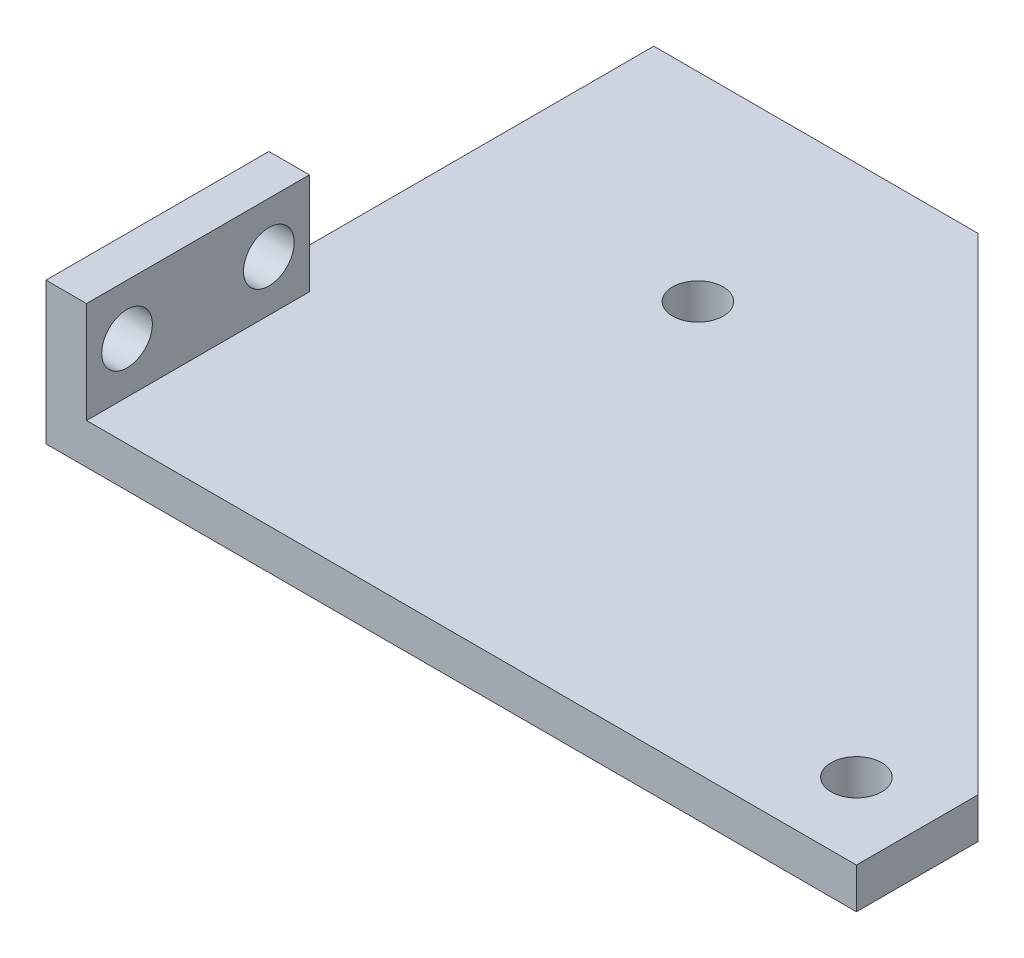
ISO-10303-21;
HEADER;
FILE_DESCRIPTION(('STEP AP214'),'2;1');
FILE_NAME('part.step','',(''),(''),'','','');
FILE_SCHEMA(('AUTOMOTIVE_DESIGN { 1 0 10303 214 1 1 1 1 }'));
ENDSEC;
DATA;
#1=APPLICATION_CONTEXT('core data for automotive mechanical design processes');
#2=APPLICATION_PROTOCOL_DEFINITION('international standard','automotive_design',2000,#1);
#3=PRODUCT_CONTEXT('',#1,'mechanical');
#4=PRODUCT('Part','Part','',(#3));
#5=PRODUCT_RELATED_PRODUCT_CATEGORY('part','',(#4));
#6=PRODUCT_DEFINITION_FORMATION('','',#4);
#7=PRODUCT_DEFINITION_CONTEXT('part definition',#1,'design');
#8=PRODUCT_DEFINITION('design','',#6,#7);
#9=PRODUCT_DEFINITION_SHAPE('','',#8);
#10=(LENGTH_UNIT() NAMED_UNIT(*) SI_UNIT(.MILLI.,.METRE.));
#11=(NAMED_UNIT(*) PLANE_ANGLE_UNIT() SI_UNIT($,.RADIAN.));
#12=(NAMED_UNIT(*) SI_UNIT($,.STERADIAN.) SOLID_ANGLE_UNIT());
#13=UNCERTAINTY_MEASURE_WITH_UNIT(LENGTH_MEASURE(1.E-05),#10,'distance_accuracy_value','');
#14=(GEOMETRIC_REPRESENTATION_CONTEXT(3) GLOBAL_UNCERTAINTY_ASSIGNED_CONTEXT((#13)) GLOBAL_UNIT_ASSIGNED_CONTEXT((#10,
#11,#12)) REPRESENTATION_CONTEXT('',''));
#15=CARTESIAN_POINT('',(0.,0.,0.));
#16=DIRECTION('',(0.,0.,1.));
#17=DIRECTION('',(1.,0.,0.));
#18=AXIS2_PLACEMENT_3D('',#15,#16,#17);
#19=CARTESIAN_POINT('',(0.,4.,0.));
#20=DIRECTION('',(0.,1.,0.));
#21=DIRECTION('',(0.,0.,1.));
#22=AXIS2_PLACEMENT_3D('',#19,#20,#21);
#23=PLANE('',#22);
#24=DIRECTION('',(-1.,0.,0.));
#25=VECTOR('',#24,1.);
#26=CARTESIAN_POINT('',(0.,4.,-22.));
#27=LINE('',#26,#25);
#28=CARTESIAN_POINT('',(4.,4.,-22.));
#29=VERTEX_POINT('',#28);
#30=CARTESIAN_POINT('',(0.,4.,-22.));
#31=VERTEX_POINT('',#30);
#32=EDGE_CURVE('E124',#29,#31,#27,.T.);
#33=ORIENTED_EDGE('',*,*,#32,.F.);
#34=DIRECTION('',(0.,0.,-1.));
#35=VECTOR('',#34,1.);
#36=CARTESIAN_POINT('',(4.,4.,0.));
#37=LINE('',#36,#35);
#38=CARTESIAN_POINT('',(4.,4.,0.));
#39=VERTEX_POINT('',#38);
#40=EDGE_CURVE('E54',#39,#29,#37,.T.);
#41=ORIENTED_EDGE('',*,*,#40,.F.);
#42=DIRECTION('',(1.,0.,0.));
#43=VECTOR('',#42,1.);
#44=CARTESIAN_POINT('',(0.,4.,0.));
#45=LINE('',#44,#43);
#46=CARTESIAN_POINT('',(80.,4.,0.));
#47=VERTEX_POINT('',#46);
#48=EDGE_CURVE('E153',#39,#47,#45,.T.);
#49=ORIENTED_EDGE('',*,*,#48,.T.);
#50=DIRECTION('',(0.,0.,-1.));
#51=VECTOR('',#50,1.);
#52=CARTESIAN_POINT('',(80.,4.,0.));
#53=LINE('',#52,#51);
#54=CARTESIAN_POINT('',(80.,4.,-11.9999999999998));
#55=VERTEX_POINT('',#54);
#56=EDGE_CURVE('E156',#47,#55,#53,.T.);
#57=ORIENTED_EDGE('',*,*,#56,.T.);
#58=DIRECTION('',(-0.707106781186546,0.,-0.707106781186549));
#59=VECTOR('',#58,1.);
#60=CARTESIAN_POINT('',(32.,4.,-60.));
#61=LINE('',#60,#59);
#62=CARTESIAN_POINT('',(32.,4.,-60.));
#63=VERTEX_POINT('',#62);
#64=EDGE_CURVE('E158',#55,#63,#61,.T.);
#65=ORIENTED_EDGE('',*,*,#64,.T.);
#66=DIRECTION('',(-1.,0.,0.));
#67=VECTOR('',#66,1.);
#68=CARTESIAN_POINT('',(32.,4.,-60.));
#69=LINE('',#68,#67);
#70=CARTESIAN_POINT('',(0.,4.,-60.));
#71=VERTEX_POINT('',#70);
#72=EDGE_CURVE('E160',#63,#71,#69,.T.);
#73=ORIENTED_EDGE('',*,*,#72,.T.);
#74=DIRECTION('',(0.,0.,1.));
#75=VECTOR('',#74,1.);
#76=CARTESIAN_POINT('',(0.,4.,0.));
#77=LINE('',#76,#75);
#78=EDGE_CURVE('E60',#71,#31,#77,.T.);
#79=ORIENTED_EDGE('',*,*,#78,.T.);
#80=EDGE_LOOP('',(#33,#41,#49,#57,#65,#73,#79));
#81=FACE_BOUND('',#80,.T.);
#82=CARTESIAN_POINT('',(24.,4.,-40.35));
#83=DIRECTION('',(0.,1.,0.));
#84=DIRECTION('',(0.,0.,1.));
#85=AXIS2_PLACEMENT_3D('',#82,#83,#84);
#86=CIRCLE('',#85,2.5);
#87=CARTESIAN_POINT('',(24.,4.,-37.85));
#88=VERTEX_POINT('',#87);
#89=EDGE_CURVE('E147',#88,#88,#86,.T.);
#90=ORIENTED_EDGE('',*,*,#89,.F.);
#91=EDGE_LOOP('',(#90));
#92=FACE_BOUND('',#91,.T.);
#93=CARTESIAN_POINT('',(72.5,4.,-7.5));
#94=DIRECTION('',(0.,1.,0.));
#95=DIRECTION('',(0.,0.,1.));
#96=AXIS2_PLACEMENT_3D('',#93,#94,#95);
#97=CIRCLE('',#96,2.5);
#98=CARTESIAN_POINT('',(72.5,4.,-5.));
#99=VERTEX_POINT('',#98);
#100=EDGE_CURVE('E141',#99,#99,#97,.T.);
#101=ORIENTED_EDGE('',*,*,#100,.F.);
#102=EDGE_LOOP('',(#101));
#103=FACE_BOUND('',#102,.T.);
#104=ADVANCED_FACE('F37',(#81,#92,#103),#23,.T.);
#105=CARTESIAN_POINT('',(0.,0.,0.));
#106=DIRECTION('',(0.,1.,0.));
#107=DIRECTION('',(0.,0.,1.));
#108=AXIS2_PLACEMENT_3D('',#105,#106,#107);
#109=PLANE('',#108);
#110=DIRECTION('',(0.,0.,1.));
#111=VECTOR('',#110,1.);
#112=CARTESIAN_POINT('',(0.,0.,0.));
#113=LINE('',#112,#111);
#114=CARTESIAN_POINT('',(0.,0.,-60.));
#115=VERTEX_POINT('',#114);
#116=CARTESIAN_POINT('',(0.,0.,0.));
#117=VERTEX_POINT('',#116);
#118=EDGE_CURVE('E109',#115,#117,#113,.T.);
#119=ORIENTED_EDGE('',*,*,#118,.F.);
#120=DIRECTION('',(-1.,0.,0.));
#121=VECTOR('',#120,1.);
#122=CARTESIAN_POINT('',(32.,0.,-60.));
#123=LINE('',#122,#121);
#124=CARTESIAN_POINT('',(32.,0.,-60.));
#125=VERTEX_POINT('',#124);
#126=EDGE_CURVE('E154',#125,#115,#123,.T.);
#127=ORIENTED_EDGE('',*,*,#126,.F.);
#128=DIRECTION('',(-0.707106781186546,0.,-0.707106781186549));
#129=VECTOR('',#128,1.);
#130=CARTESIAN_POINT('',(32.,0.,-60.));
#131=LINE('',#130,#129);
#132=CARTESIAN_POINT('',(80.,0.,-11.9999999999998));
#133=VERTEX_POINT('',#132);
#134=EDGE_CURVE('E168',#133,#125,#131,.T.);
#135=ORIENTED_EDGE('',*,*,#134,.F.);
#136=DIRECTION('',(0.,0.,-1.));
#137=VECTOR('',#136,1.);
#138=CARTESIAN_POINT('',(80.,0.,0.));
#139=LINE('',#138,#137);
#140=CARTESIAN_POINT('',(80.,0.,0.));
#141=VERTEX_POINT('',#140);
#142=EDGE_CURVE('E166',#141,#133,#139,.T.);
#143=ORIENTED_EDGE('',*,*,#142,.F.);
#144=DIRECTION('',(1.,0.,0.));
#145=VECTOR('',#144,1.);
#146=CARTESIAN_POINT('',(0.,0.,0.));
#147=LINE('',#146,#145);
#148=EDGE_CURVE('E164',#117,#141,#147,.T.);
#149=ORIENTED_EDGE('',*,*,#148,.F.);
#150=EDGE_LOOP('',(#119,#127,#135,#143,#149));
#151=FACE_BOUND('',#150,.T.);
#152=CARTESIAN_POINT('',(24.,0.,-40.35));
#153=DIRECTION('',(0.,1.,0.));
#154=DIRECTION('',(0.,0.,1.));
#155=AXIS2_PLACEMENT_3D('',#152,#153,#154);
#156=CIRCLE('',#155,2.5);
#157=CARTESIAN_POINT('',(24.,0.,-37.85));
#158=VERTEX_POINT('',#157);
#159=EDGE_CURVE('E144',#158,#158,#156,.T.);
#160=ORIENTED_EDGE('',*,*,#159,.T.);
#161=EDGE_LOOP('',(#160));
#162=FACE_BOUND('',#161,.T.);
#163=CARTESIAN_POINT('',(72.5,0.,-7.5));
#164=DIRECTION('',(0.,1.,0.));
#165=DIRECTION('',(0.,0.,1.));
#166=AXIS2_PLACEMENT_3D('',#163,#164,#165);
#167=CIRCLE('',#166,2.5);
#168=CARTESIAN_POINT('',(72.5,0.,-5.));
#169=VERTEX_POINT('',#168);
#170=EDGE_CURVE('E140',#169,#169,#167,.T.);
#171=ORIENTED_EDGE('',*,*,#170,.T.);
#172=EDGE_LOOP('',(#171));
#173=FACE_BOUND('',#172,.T.);
#174=ADVANCED_FACE('F195',(#151,#162,#173),#109,.F.);
#175=CARTESIAN_POINT('',(0.,4.,0.));
#176=DIRECTION('',(1.,0.,0.));
#177=DIRECTION('',(0.,0.,-1.));
#178=AXIS2_PLACEMENT_3D('',#175,#176,#177);
#179=PLANE('',#178);
#180=CARTESIAN_POINT('',(0.,9.,-18.));
#181=DIRECTION('',(-1.,0.,0.));
#182=DIRECTION('',(0.,0.,1.));
#183=AXIS2_PLACEMENT_3D('',#180,#181,#182);
#184=CIRCLE('',#183,2.5);
#185=CARTESIAN_POINT('',(0.,9.,-15.5));
#186=VERTEX_POINT('',#185);
#187=EDGE_CURVE('E181',#186,#186,#184,.T.);
#188=ORIENTED_EDGE('',*,*,#187,.F.);
#189=EDGE_LOOP('',(#188));
#190=FACE_BOUND('',#189,.T.);
#191=CARTESIAN_POINT('',(0.,9.,-4.));
#192=DIRECTION('',(-1.,0.,0.));
#193=DIRECTION('',(0.,0.,1.));
#194=AXIS2_PLACEMENT_3D('',#191,#192,#193);
#195=CIRCLE('',#194,2.5);
#196=CARTESIAN_POINT('',(0.,9.,-1.5));
#197=VERTEX_POINT('',#196);
#198=EDGE_CURVE('E128',#197,#197,#195,.T.);
#199=ORIENTED_EDGE('',*,*,#198,.F.);
#200=EDGE_LOOP('',(#199));
#201=FACE_BOUND('',#200,.T.);
#202=ORIENTED_EDGE('',*,*,#118,.T.);
#203=DIRECTION('',(0.,-1.,0.));
#204=VECTOR('',#203,1.);
#205=CARTESIAN_POINT('',(0.,4.,0.));
#206=LINE('',#205,#204);
#207=CARTESIAN_POINT('',(0.,14.,0.));
#208=VERTEX_POINT('',#207);
#209=EDGE_CURVE('E11',#208,#117,#206,.T.);
#210=ORIENTED_EDGE('',*,*,#209,.F.);
#211=DIRECTION('',(0.,0.,1.));
#212=VECTOR('',#211,1.);
#213=CARTESIAN_POINT('',(0.,14.,0.));
#214=LINE('',#213,#212);
#215=CARTESIAN_POINT('',(0.,14.,-22.));
#216=VERTEX_POINT('',#215);
#217=EDGE_CURVE('E106',#216,#208,#214,.T.);
#218=ORIENTED_EDGE('',*,*,#217,.F.);
#219=DIRECTION('',(0.,-1.,0.));
#220=VECTOR('',#219,1.);
#221=CARTESIAN_POINT('',(0.,14.,-22.));
#222=LINE('',#221,#220);
#223=EDGE_CURVE('E133',#216,#31,#222,.T.);
#224=ORIENTED_EDGE('',*,*,#223,.T.);
#225=ORIENTED_EDGE('',*,*,#78,.F.);
#226=DIRECTION('',(0.,-1.,0.));
#227=VECTOR('',#226,1.);
#228=CARTESIAN_POINT('',(0.,4.,-60.));
#229=LINE('',#228,#227);
#230=EDGE_CURVE('E162',#71,#115,#229,.T.);
#231=ORIENTED_EDGE('',*,*,#230,.T.);
#232=EDGE_LOOP('',(#202,#210,#218,#224,#225,#231));
#233=FACE_BOUND('',#232,.T.);
#234=ADVANCED_FACE('F39',(#190,#201,#233),#179,.F.);
#235=CARTESIAN_POINT('',(0.,4.,0.));
#236=DIRECTION('',(0.,0.,-1.));
#237=DIRECTION('',(-1.,0.,0.));
#238=AXIS2_PLACEMENT_3D('',#235,#236,#237);
#239=PLANE('',#238);
#240=ORIENTED_EDGE('',*,*,#148,.T.);
#241=DIRECTION('',(0.,-1.,0.));
#242=VECTOR('',#241,1.);
#243=CARTESIAN_POINT('',(80.,4.,0.));
#244=LINE('',#243,#242);
#245=EDGE_CURVE('E46',#47,#141,#244,.T.);
#246=ORIENTED_EDGE('',*,*,#245,.F.);
#247=ORIENTED_EDGE('',*,*,#48,.F.);
#248=DIRECTION('',(0.,-1.,0.));
#249=VECTOR('',#248,1.);
#250=CARTESIAN_POINT('',(4.,14.,0.));
#251=LINE('',#250,#249);
#252=CARTESIAN_POINT('',(4.,14.,0.));
#253=VERTEX_POINT('',#252);
#254=EDGE_CURVE('E115',#253,#39,#251,.T.);
#255=ORIENTED_EDGE('',*,*,#254,.F.);
#256=DIRECTION('',(1.,0.,0.));
#257=VECTOR('',#256,1.);
#258=CARTESIAN_POINT('',(0.,14.,0.));
#259=LINE('',#258,#257);
#260=EDGE_CURVE('E112',#208,#253,#259,.T.);
#261=ORIENTED_EDGE('',*,*,#260,.F.);
#262=ORIENTED_EDGE('',*,*,#209,.T.);
#263=EDGE_LOOP('',(#240,#246,#247,#255,#261,#262));
#264=FACE_BOUND('',#263,.T.);
#265=ADVANCED_FACE('F113',(#264),#239,.F.);
#266=CARTESIAN_POINT('',(80.,4.,0.));
#267=DIRECTION('',(-1.,0.,0.));
#268=DIRECTION('',(0.,0.,1.));
#269=AXIS2_PLACEMENT_3D('',#266,#267,#268);
#270=PLANE('',#269);
#271=ORIENTED_EDGE('',*,*,#142,.T.);
#272=DIRECTION('',(0.,-1.,0.));
#273=VECTOR('',#272,1.);
#274=CARTESIAN_POINT('',(80.,4.,-11.9999999999998));
#275=LINE('',#274,#273);
#276=EDGE_CURVE('E175',#55,#133,#275,.T.);
#277=ORIENTED_EDGE('',*,*,#276,.F.);
#278=ORIENTED_EDGE('',*,*,#56,.F.);
#279=ORIENTED_EDGE('',*,*,#245,.T.);
#280=EDGE_LOOP('',(#271,#277,#278,#279));
#281=FACE_BOUND('',#280,.T.);
#282=ADVANCED_FACE('F201',(#281),#270,.F.);
#283=CARTESIAN_POINT('',(32.,4.,-60.));
#284=DIRECTION('',(-0.707106781186549,0.,0.707106781186546));
#285=DIRECTION('',(0.707106781186546,0.,0.707106781186549));
#286=AXIS2_PLACEMENT_3D('',#283,#284,#285);
#287=PLANE('',#286);
#288=ORIENTED_EDGE('',*,*,#134,.T.);
#289=DIRECTION('',(0.,-1.,0.));
#290=VECTOR('',#289,1.);
#291=CARTESIAN_POINT('',(32.,4.,-60.));
#292=LINE('',#291,#290);
#293=EDGE_CURVE('E172',#63,#125,#292,.T.);
#294=ORIENTED_EDGE('',*,*,#293,.F.);
#295=ORIENTED_EDGE('',*,*,#64,.F.);
#296=ORIENTED_EDGE('',*,*,#276,.T.);
#297=EDGE_LOOP('',(#288,#294,#295,#296));
#298=FACE_BOUND('',#297,.T.);
#299=ADVANCED_FACE('F216',(#298),#287,.F.);
#300=CARTESIAN_POINT('',(32.,4.,-60.));
#301=DIRECTION('',(0.,0.,1.));
#302=DIRECTION('',(1.,0.,0.));
#303=AXIS2_PLACEMENT_3D('',#300,#301,#302);
#304=PLANE('',#303);
#305=ORIENTED_EDGE('',*,*,#126,.T.);
#306=ORIENTED_EDGE('',*,*,#230,.F.);
#307=ORIENTED_EDGE('',*,*,#72,.F.);
#308=ORIENTED_EDGE('',*,*,#293,.T.);
#309=EDGE_LOOP('',(#305,#306,#307,#308));
#310=FACE_BOUND('',#309,.T.);
#311=ADVANCED_FACE('F213',(#310),#304,.F.);
#312=CARTESIAN_POINT('',(24.,4.,-40.35));
#313=DIRECTION('',(0.,-1.,0.));
#314=DIRECTION('',(0.,0.,-1.));
#315=AXIS2_PLACEMENT_3D('',#312,#313,#314);
#316=CYLINDRICAL_SURFACE('',#315,2.5);
#317=ORIENTED_EDGE('',*,*,#89,.T.);
#318=EDGE_LOOP('',(#317));
#319=FACE_BOUND('',#318,.T.);
#320=ORIENTED_EDGE('',*,*,#159,.F.);
#321=EDGE_LOOP('',(#320));
#322=FACE_BOUND('',#321,.T.);
#323=ADVANCED_FACE('F210',(#319,#322),#316,.F.);
#324=CARTESIAN_POINT('',(72.5,4.,-7.5));
#325=DIRECTION('',(0.,-1.,0.));
#326=DIRECTION('',(0.,0.,-1.));
#327=AXIS2_PLACEMENT_3D('',#324,#325,#326);
#328=CYLINDRICAL_SURFACE('',#327,2.5);
#329=ORIENTED_EDGE('',*,*,#100,.T.);
#330=EDGE_LOOP('',(#329));
#331=FACE_BOUND('',#330,.T.);
#332=ORIENTED_EDGE('',*,*,#170,.F.);
#333=EDGE_LOOP('',(#332));
#334=FACE_BOUND('',#333,.T.);
#335=ADVANCED_FACE('F242',(#331,#334),#328,.F.);
#336=CARTESIAN_POINT('',(4.,14.,0.));
#337=DIRECTION('',(-1.,0.,0.));
#338=DIRECTION('',(0.,0.,1.));
#339=AXIS2_PLACEMENT_3D('',#336,#337,#338);
#340=PLANE('',#339);
#341=CARTESIAN_POINT('',(4.,9.,-18.));
#342=DIRECTION('',(-1.,0.,0.));
#343=DIRECTION('',(0.,0.,1.));
#344=AXIS2_PLACEMENT_3D('',#341,#342,#343);
#345=CIRCLE('',#344,2.5);
#346=CARTESIAN_POINT('',(4.,9.,-15.5));
#347=VERTEX_POINT('',#346);
#348=EDGE_CURVE('E41',#347,#347,#345,.T.);
#349=ORIENTED_EDGE('',*,*,#348,.T.);
#350=EDGE_LOOP('',(#349));
#351=FACE_BOUND('',#350,.T.);
#352=CARTESIAN_POINT('',(4.,9.,-4.));
#353=DIRECTION('',(-1.,0.,0.));
#354=DIRECTION('',(0.,0.,1.));
#355=AXIS2_PLACEMENT_3D('',#352,#353,#354);
#356=CIRCLE('',#355,2.5);
#357=CARTESIAN_POINT('',(4.,9.,-1.5));
#358=VERTEX_POINT('',#357);
#359=EDGE_CURVE('E179',#358,#358,#356,.T.);
#360=ORIENTED_EDGE('',*,*,#359,.T.);
#361=EDGE_LOOP('',(#360));
#362=FACE_BOUND('',#361,.T.);
#363=ORIENTED_EDGE('',*,*,#40,.T.);
#364=DIRECTION('',(0.,-1.,0.));
#365=VECTOR('',#364,1.);
#366=CARTESIAN_POINT('',(4.,14.,-22.));
#367=LINE('',#366,#365);
#368=CARTESIAN_POINT('',(4.,14.,-22.));
#369=VERTEX_POINT('',#368);
#370=EDGE_CURVE('E136',#369,#29,#367,.T.);
#371=ORIENTED_EDGE('',*,*,#370,.F.);
#372=DIRECTION('',(0.,0.,-1.));
#373=VECTOR('',#372,1.);
#374=CARTESIAN_POINT('',(4.,14.,0.));
#375=LINE('',#374,#373);
#376=EDGE_CURVE('E118',#253,#369,#375,.T.);
#377=ORIENTED_EDGE('',*,*,#376,.F.);
#378=ORIENTED_EDGE('',*,*,#254,.T.);
#379=EDGE_LOOP('',(#363,#371,#377,#378));
#380=FACE_BOUND('',#379,.T.);
#381=ADVANCED_FACE('F240',(#351,#362,#380),#340,.F.);
#382=CARTESIAN_POINT('',(0.,14.,-22.));
#383=DIRECTION('',(0.,0.,1.));
#384=DIRECTION('',(1.,0.,0.));
#385=AXIS2_PLACEMENT_3D('',#382,#383,#384);
#386=PLANE('',#385);
#387=ORIENTED_EDGE('',*,*,#32,.T.);
#388=ORIENTED_EDGE('',*,*,#223,.F.);
#389=DIRECTION('',(-1.,0.,0.));
#390=VECTOR('',#389,1.);
#391=CARTESIAN_POINT('',(0.,14.,-22.));
#392=LINE('',#391,#390);
#393=EDGE_CURVE('E122',#369,#216,#392,.T.);
#394=ORIENTED_EDGE('',*,*,#393,.F.);
#395=ORIENTED_EDGE('',*,*,#370,.T.);
#396=EDGE_LOOP('',(#387,#388,#394,#395));
#397=FACE_BOUND('',#396,.T.);
#398=ADVANCED_FACE('F237',(#397),#386,.F.);
#399=CARTESIAN_POINT('',(0.,14.,0.));
#400=DIRECTION('',(0.,-1.,0.));
#401=DIRECTION('',(0.,0.,-1.));
#402=AXIS2_PLACEMENT_3D('',#399,#400,#401);
#403=PLANE('',#402);
#404=ORIENTED_EDGE('',*,*,#217,.T.);
#405=ORIENTED_EDGE('',*,*,#260,.T.);
#406=ORIENTED_EDGE('',*,*,#376,.T.);
#407=ORIENTED_EDGE('',*,*,#393,.T.);
#408=EDGE_LOOP('',(#404,#405,#406,#407));
#409=FACE_BOUND('',#408,.T.);
#410=ADVANCED_FACE('F120',(#409),#403,.F.);
#411=CARTESIAN_POINT('',(20.,9.,-4.));
#412=DIRECTION('',(-1.,0.,0.));
#413=DIRECTION('',(0.,0.,1.));
#414=AXIS2_PLACEMENT_3D('',#411,#412,#413);
#415=CYLINDRICAL_SURFACE('',#414,2.5);
#416=ORIENTED_EDGE('',*,*,#198,.T.);
#417=EDGE_LOOP('',(#416));
#418=FACE_BOUND('',#417,.T.);
#419=ORIENTED_EDGE('',*,*,#359,.F.);
#420=EDGE_LOOP('',(#419));
#421=FACE_BOUND('',#420,.T.);
#422=ADVANCED_FACE('F191',(#418,#421),#415,.F.);
#423=CARTESIAN_POINT('',(20.,9.,-18.));
#424=DIRECTION('',(-1.,0.,0.));
#425=DIRECTION('',(0.,0.,1.));
#426=AXIS2_PLACEMENT_3D('',#423,#424,#425);
#427=CYLINDRICAL_SURFACE('',#426,2.5);
#428=ORIENTED_EDGE('',*,*,#187,.T.);
#429=EDGE_LOOP('',(#428));
#430=FACE_BOUND('',#429,.T.);
#431=ORIENTED_EDGE('',*,*,#348,.F.);
#432=EDGE_LOOP('',(#431));
#433=FACE_BOUND('',#432,.T.);
#434=ADVANCED_FACE('F256',(#430,#433),#427,.F.);
#435=CLOSED_SHELL('',(#104,#174,#234,#265,#282,#299,#311,#323,#335,#381,#398,#410,#422,#434));
#436=MANIFOLD_SOLID_BREP('B2',#435);
#437=ADVANCED_BREP_SHAPE_REPRESENTATION('',(#18,#436),#14);
#438=SHAPE_DEFINITION_REPRESENTATION(#9,#437);
ENDSEC;
END-ISO-10303-21;
